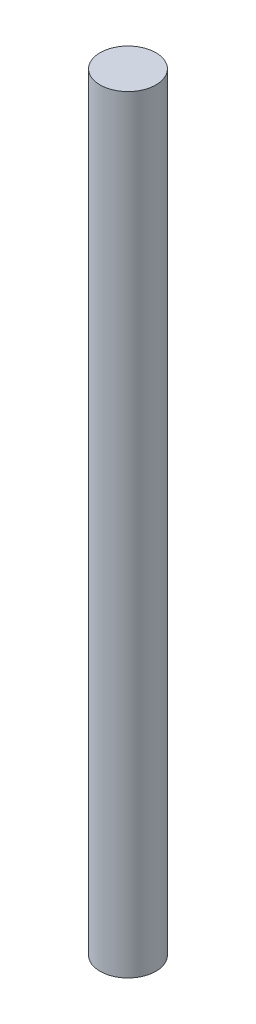
ISO-10303-21;
HEADER;
FILE_DESCRIPTION(('STEP AP214'),'2;1');
FILE_NAME('part.step','',(''),(''),'','','');
FILE_SCHEMA(('AUTOMOTIVE_DESIGN { 1 0 10303 214 1 1 1 1 }'));
ENDSEC;
DATA;
#1=APPLICATION_CONTEXT('core data for automotive mechanical design processes');
#2=APPLICATION_PROTOCOL_DEFINITION('international standard','automotive_design',2000,#1);
#3=PRODUCT_CONTEXT('',#1,'mechanical');
#4=PRODUCT('Part','Part','',(#3));
#5=PRODUCT_RELATED_PRODUCT_CATEGORY('part','',(#4));
#6=PRODUCT_DEFINITION_FORMATION('','',#4);
#7=PRODUCT_DEFINITION_CONTEXT('part definition',#1,'design');
#8=PRODUCT_DEFINITION('design','',#6,#7);
#9=PRODUCT_DEFINITION_SHAPE('','',#8);
#10=(LENGTH_UNIT() NAMED_UNIT(*) SI_UNIT(.MILLI.,.METRE.));
#11=(NAMED_UNIT(*) PLANE_ANGLE_UNIT() SI_UNIT($,.RADIAN.));
#12=(NAMED_UNIT(*) SI_UNIT($,.STERADIAN.) SOLID_ANGLE_UNIT());
#13=UNCERTAINTY_MEASURE_WITH_UNIT(LENGTH_MEASURE(1.E-05),#10,'distance_accuracy_value','');
#14=(GEOMETRIC_REPRESENTATION_CONTEXT(3) GLOBAL_UNCERTAINTY_ASSIGNED_CONTEXT((#13)) GLOBAL_UNIT_ASSIGNED_CONTEXT((#10,
#11,#12)) REPRESENTATION_CONTEXT('',''));
#15=CARTESIAN_POINT('',(0.,0.,0.));
#16=DIRECTION('',(0.,0.,1.));
#17=DIRECTION('',(1.,0.,0.));
#18=AXIS2_PLACEMENT_3D('',#15,#16,#17);
#19=CARTESIAN_POINT('',(0.,110.,0.));
#20=DIRECTION('',(0.,-1.,0.));
#21=DIRECTION('',(0.,0.,-1.));
#22=AXIS2_PLACEMENT_3D('',#19,#20,#21);
#23=CYLINDRICAL_SURFACE('',#22,4.);
#24=CARTESIAN_POINT('',(0.,110.,0.));
#25=DIRECTION('',(0.,1.,0.));
#26=DIRECTION('',(0.,0.,1.));
#27=AXIS2_PLACEMENT_3D('',#24,#25,#26);
#28=CIRCLE('',#27,4.);
#29=CARTESIAN_POINT('',(0.,110.,4.));
#30=VERTEX_POINT('',#29);
#31=EDGE_CURVE('E10',#30,#30,#28,.T.);
#32=ORIENTED_EDGE('',*,*,#31,.F.);
#33=EDGE_LOOP('',(#32));
#34=FACE_BOUND('',#33,.T.);
#35=CARTESIAN_POINT('',(0.,0.,0.));
#36=DIRECTION('',(0.,1.,0.));
#37=DIRECTION('',(0.,0.,1.));
#38=AXIS2_PLACEMENT_3D('',#35,#36,#37);
#39=CIRCLE('',#38,4.);
#40=CARTESIAN_POINT('',(0.,0.,4.));
#41=VERTEX_POINT('',#40);
#42=EDGE_CURVE('E34',#41,#41,#39,.T.);
#43=ORIENTED_EDGE('',*,*,#42,.T.);
#44=EDGE_LOOP('',(#43));
#45=FACE_BOUND('',#44,.T.);
#46=ADVANCED_FACE('F31',(#34,#45),#23,.T.);
#47=CARTESIAN_POINT('',(0.,110.,0.));
#48=DIRECTION('',(0.,1.,0.));
#49=DIRECTION('',(0.,0.,1.));
#50=AXIS2_PLACEMENT_3D('',#47,#48,#49);
#51=PLANE('',#50);
#52=ORIENTED_EDGE('',*,*,#31,.T.);
#53=EDGE_LOOP('',(#52));
#54=FACE_BOUND('',#53,.T.);
#55=ADVANCED_FACE('F46',(#54),#51,.T.);
#56=CARTESIAN_POINT('',(0.,0.,0.));
#57=DIRECTION('',(0.,1.,0.));
#58=DIRECTION('',(0.,0.,1.));
#59=AXIS2_PLACEMENT_3D('',#56,#57,#58);
#60=PLANE('',#59);
#61=ORIENTED_EDGE('',*,*,#42,.F.);
#62=EDGE_LOOP('',(#61));
#63=FACE_BOUND('',#62,.T.);
#64=ADVANCED_FACE('F44',(#63),#60,.F.);
#65=CLOSED_SHELL('',(#46,#55,#64));
#66=MANIFOLD_SOLID_BREP('B2',#65);
#67=ADVANCED_BREP_SHAPE_REPRESENTATION('',(#18,#66),#14);
#68=SHAPE_DEFINITION_REPRESENTATION(#9,#67);
ENDSEC;
END-ISO-10303-21;
